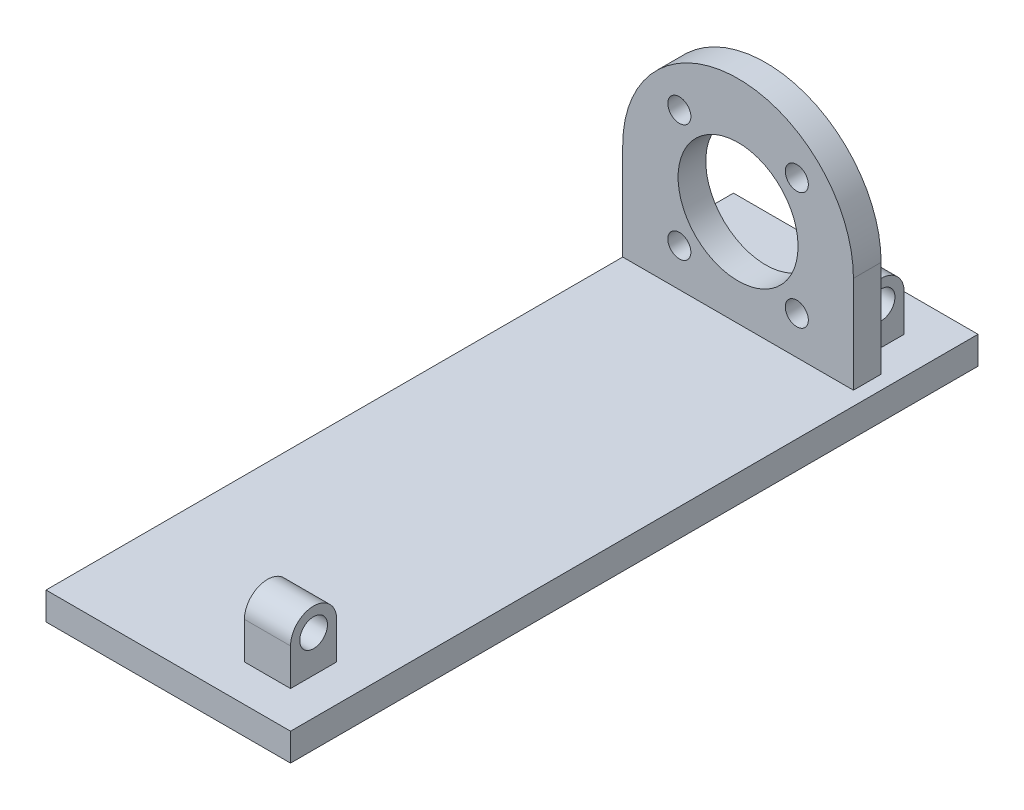
ISO-10303-21;
HEADER;
FILE_DESCRIPTION(('STEP AP214'),'2;1');
FILE_NAME('part.step','',(''),(''),'','','');
FILE_SCHEMA(('AUTOMOTIVE_DESIGN { 1 0 10303 214 1 1 1 1 }'));
ENDSEC;
DATA;
#1=APPLICATION_CONTEXT('core data for automotive mechanical design processes');
#2=APPLICATION_PROTOCOL_DEFINITION('international standard','automotive_design',2000,#1);
#3=PRODUCT_CONTEXT('',#1,'mechanical');
#4=PRODUCT('Part','Part','',(#3));
#5=PRODUCT_RELATED_PRODUCT_CATEGORY('part','',(#4));
#6=PRODUCT_DEFINITION_FORMATION('','',#4);
#7=PRODUCT_DEFINITION_CONTEXT('part definition',#1,'design');
#8=PRODUCT_DEFINITION('design','',#6,#7);
#9=PRODUCT_DEFINITION_SHAPE('','',#8);
#10=(LENGTH_UNIT() NAMED_UNIT(*) SI_UNIT(.MILLI.,.METRE.));
#11=(NAMED_UNIT(*) PLANE_ANGLE_UNIT() SI_UNIT($,.RADIAN.));
#12=(NAMED_UNIT(*) SI_UNIT($,.STERADIAN.) SOLID_ANGLE_UNIT());
#13=UNCERTAINTY_MEASURE_WITH_UNIT(LENGTH_MEASURE(1.E-05),#10,'distance_accuracy_value','');
#14=(GEOMETRIC_REPRESENTATION_CONTEXT(3) GLOBAL_UNCERTAINTY_ASSIGNED_CONTEXT((#13)) GLOBAL_UNIT_ASSIGNED_CONTEXT((#10,
#11,#12)) REPRESENTATION_CONTEXT('',''));
#15=CARTESIAN_POINT('',(0.,0.,0.));
#16=DIRECTION('',(0.,0.,1.));
#17=DIRECTION('',(1.,0.,0.));
#18=AXIS2_PLACEMENT_3D('',#15,#16,#17);
#19=CARTESIAN_POINT('',(25.,-9.,3.));
#20=DIRECTION('',(-1.,0.,0.));
#21=DIRECTION('',(0.,-1.,0.));
#22=AXIS2_PLACEMENT_3D('',#19,#20,#21);
#23=PLANE('',#22);
#24=DIRECTION('',(0.,0.,1.));
#25=VECTOR('',#24,1.);
#26=CARTESIAN_POINT('',(25.,-12.,-3.));
#27=LINE('',#26,#25);
#28=CARTESIAN_POINT('',(25.,-12.,-3.));
#29=VERTEX_POINT('',#28);
#30=CARTESIAN_POINT('',(25.,-12.,3.));
#31=VERTEX_POINT('',#30);
#32=EDGE_CURVE('E189',#29,#31,#27,.T.);
#33=ORIENTED_EDGE('',*,*,#32,.F.);
#34=DIRECTION('',(0.,1.,0.));
#35=VECTOR('',#34,1.);
#36=CARTESIAN_POINT('',(25.,-9.,-3.));
#37=LINE('',#36,#35);
#38=CARTESIAN_POINT('',(25.,8.99999999999999,-3.));
#39=VERTEX_POINT('',#38);
#40=EDGE_CURVE('E322',#29,#39,#37,.T.);
#41=ORIENTED_EDGE('',*,*,#40,.T.);
#42=DIRECTION('',(0.,0.,-1.));
#43=VECTOR('',#42,1.);
#44=CARTESIAN_POINT('',(25.,8.99999999999999,3.));
#45=LINE('',#44,#43);
#46=CARTESIAN_POINT('',(25.,8.99999999999999,3.));
#47=VERTEX_POINT('',#46);
#48=EDGE_CURVE('E51',#47,#39,#45,.T.);
#49=ORIENTED_EDGE('',*,*,#48,.F.);
#50=DIRECTION('',(0.,1.,0.));
#51=VECTOR('',#50,1.);
#52=CARTESIAN_POINT('',(25.,-9.,3.));
#53=LINE('',#52,#51);
#54=EDGE_CURVE('E324',#31,#47,#53,.T.);
#55=ORIENTED_EDGE('',*,*,#54,.F.);
#56=EDGE_LOOP('',(#33,#41,#49,#55));
#57=FACE_BOUND('',#56,.T.);
#58=ADVANCED_FACE('F43',(#57),#23,.F.);
#59=CARTESIAN_POINT('',(0.,9.,-3.));
#60=DIRECTION('',(0.,0.,1.));
#61=DIRECTION('',(1.,0.,0.));
#62=AXIS2_PLACEMENT_3D('',#59,#60,#61);
#63=PLANE('',#62);
#64=CARTESIAN_POINT('',(-12.7279220613578,21.7279220613579,-3.));
#65=DIRECTION('',(0.,0.,1.));
#66=DIRECTION('',(1.,0.,0.));
#67=AXIS2_PLACEMENT_3D('',#64,#65,#66);
#68=CIRCLE('',#67,2.49999999999908);
#69=CARTESIAN_POINT('',(-10.2279220613588,21.7279220613579,-3.));
#70=VERTEX_POINT('',#69);
#71=EDGE_CURVE('E279',#70,#70,#68,.T.);
#72=ORIENTED_EDGE('',*,*,#71,.T.);
#73=EDGE_LOOP('',(#72));
#74=FACE_BOUND('',#73,.T.);
#75=CARTESIAN_POINT('',(-12.7279220613579,-3.72792206135783,-3.));
#76=DIRECTION('',(0.,0.,1.));
#77=DIRECTION('',(1.,0.,0.));
#78=AXIS2_PLACEMENT_3D('',#75,#76,#77);
#79=CIRCLE('',#78,2.49999999999936);
#80=CARTESIAN_POINT('',(-10.2279220613585,-3.72792206135783,-3.));
#81=VERTEX_POINT('',#80);
#82=EDGE_CURVE('E293',#81,#81,#79,.T.);
#83=ORIENTED_EDGE('',*,*,#82,.T.);
#84=EDGE_LOOP('',(#83));
#85=FACE_BOUND('',#84,.T.);
#86=CARTESIAN_POINT('',(12.7279220613579,21.7279220613578,-3.));
#87=DIRECTION('',(0.,0.,1.));
#88=DIRECTION('',(1.,0.,0.));
#89=AXIS2_PLACEMENT_3D('',#86,#87,#88);
#90=CIRCLE('',#89,2.5);
#91=CARTESIAN_POINT('',(15.2279220613579,21.7279220613578,-3.));
#92=VERTEX_POINT('',#91);
#93=EDGE_CURVE('E299',#92,#92,#90,.T.);
#94=ORIENTED_EDGE('',*,*,#93,.T.);
#95=EDGE_LOOP('',(#94));
#96=FACE_BOUND('',#95,.T.);
#97=CARTESIAN_POINT('',(0.,9.,-3.));
#98=DIRECTION('',(0.,0.,1.));
#99=DIRECTION('',(1.,0.,0.));
#100=AXIS2_PLACEMENT_3D('',#97,#98,#99);
#101=CIRCLE('',#100,13.);
#102=CARTESIAN_POINT('',(13.,9.,-3.));
#103=VERTEX_POINT('',#102);
#104=EDGE_CURVE('E315',#103,#103,#101,.T.);
#105=ORIENTED_EDGE('',*,*,#104,.T.);
#106=EDGE_LOOP('',(#105));
#107=FACE_BOUND('',#106,.T.);
#108=DIRECTION('',(0.,-1.,0.));
#109=VECTOR('',#108,1.);
#110=CARTESIAN_POINT('',(20.,-4.,-3.));
#111=LINE('',#110,#109);
#112=CARTESIAN_POINT('',(20.,-4.,-3.));
#113=VERTEX_POINT('',#112);
#114=CARTESIAN_POINT('',(20.,-12.,-3.));
#115=VERTEX_POINT('',#114);
#116=EDGE_CURVE('E249',#113,#115,#111,.T.);
#117=ORIENTED_EDGE('',*,*,#116,.F.);
#118=DIRECTION('',(1.,0.,0.));
#119=VECTOR('',#118,1.);
#120=CARTESIAN_POINT('',(10.,-4.,-3.));
#121=LINE('',#120,#119);
#122=CARTESIAN_POINT('',(15.2130726795912,-4.,-3.));
#123=VERTEX_POINT('',#122);
#124=EDGE_CURVE('E250',#123,#113,#121,.T.);
#125=ORIENTED_EDGE('',*,*,#124,.F.);
#126=CARTESIAN_POINT('',(12.7279220613578,-3.72792206135788,-3.));
#127=DIRECTION('',(0.,0.,1.));
#128=DIRECTION('',(1.,0.,0.));
#129=AXIS2_PLACEMENT_3D('',#126,#127,#128);
#130=CIRCLE('',#129,2.50000000000034);
#131=CARTESIAN_POINT('',(10.2427714431244,-4.,-3.));
#132=VERTEX_POINT('',#131);
#133=EDGE_CURVE('E287',#123,#132,#130,.T.);
#134=ORIENTED_EDGE('',*,*,#133,.T.);
#135=CARTESIAN_POINT('',(10.,-4.,-3.));
#136=VERTEX_POINT('',#135);
#137=EDGE_CURVE('E261',#136,#132,#121,.T.);
#138=ORIENTED_EDGE('',*,*,#137,.F.);
#139=DIRECTION('',(0.,-1.,0.));
#140=VECTOR('',#139,1.);
#141=CARTESIAN_POINT('',(10.,-4.,-3.));
#142=LINE('',#141,#140);
#143=CARTESIAN_POINT('',(10.,-12.,-3.));
#144=VERTEX_POINT('',#143);
#145=EDGE_CURVE('E240',#136,#144,#142,.T.);
#146=ORIENTED_EDGE('',*,*,#145,.T.);
#147=DIRECTION('',(1.,0.,0.));
#148=VECTOR('',#147,1.);
#149=CARTESIAN_POINT('',(-25.,-12.,-3.));
#150=LINE('',#149,#148);
#151=CARTESIAN_POINT('',(-25.,-12.,-3.));
#152=VERTEX_POINT('',#151);
#153=EDGE_CURVE('E272',#152,#144,#150,.T.);
#154=ORIENTED_EDGE('',*,*,#153,.F.);
#155=DIRECTION('',(0.,-1.,0.));
#156=VECTOR('',#155,1.);
#157=CARTESIAN_POINT('',(-25.,-9.00000000000001,-3.));
#158=LINE('',#157,#156);
#159=CARTESIAN_POINT('',(-25.,8.99999999999999,-3.));
#160=VERTEX_POINT('',#159);
#161=EDGE_CURVE('E329',#160,#152,#158,.T.);
#162=ORIENTED_EDGE('',*,*,#161,.F.);
#163=CARTESIAN_POINT('',(0.,9.,-3.));
#164=DIRECTION('',(0.,0.,1.));
#165=DIRECTION('',(1.,0.,0.));
#166=AXIS2_PLACEMENT_3D('',#163,#164,#165);
#167=CIRCLE('',#166,25.);
#168=EDGE_CURVE('E317',#39,#160,#167,.T.);
#169=ORIENTED_EDGE('',*,*,#168,.F.);
#170=ORIENTED_EDGE('',*,*,#40,.F.);
#171=EDGE_CURVE('E258',#115,#29,#150,.T.);
#172=ORIENTED_EDGE('',*,*,#171,.F.);
#173=EDGE_LOOP('',(#117,#125,#134,#138,#146,#154,#162,#169,#170,#172));
#174=FACE_BOUND('',#173,.T.);
#175=ADVANCED_FACE('F342',(#74,#85,#96,#107,#174),#63,.F.);
#176=CARTESIAN_POINT('',(0.,9.,3.));
#177=DIRECTION('',(0.,0.,1.));
#178=DIRECTION('',(1.,0.,0.));
#179=AXIS2_PLACEMENT_3D('',#176,#177,#178);
#180=PLANE('',#179);
#181=CARTESIAN_POINT('',(-12.7279220613578,21.7279220613579,3.));
#182=DIRECTION('',(0.,0.,1.));
#183=DIRECTION('',(1.,0.,0.));
#184=AXIS2_PLACEMENT_3D('',#181,#182,#183);
#185=CIRCLE('',#184,2.49999999999908);
#186=CARTESIAN_POINT('',(-10.2279220613588,21.7279220613579,3.));
#187=VERTEX_POINT('',#186);
#188=EDGE_CURVE('E295',#187,#187,#185,.T.);
#189=ORIENTED_EDGE('',*,*,#188,.F.);
#190=EDGE_LOOP('',(#189));
#191=FACE_BOUND('',#190,.T.);
#192=CARTESIAN_POINT('',(-12.7279220613579,-3.72792206135783,3.));
#193=DIRECTION('',(0.,0.,1.));
#194=DIRECTION('',(1.,0.,0.));
#195=AXIS2_PLACEMENT_3D('',#192,#193,#194);
#196=CIRCLE('',#195,2.49999999999936);
#197=CARTESIAN_POINT('',(-10.2279220613585,-3.72792206135783,3.));
#198=VERTEX_POINT('',#197);
#199=EDGE_CURVE('E289',#198,#198,#196,.T.);
#200=ORIENTED_EDGE('',*,*,#199,.F.);
#201=EDGE_LOOP('',(#200));
#202=FACE_BOUND('',#201,.T.);
#203=CARTESIAN_POINT('',(12.7279220613578,-3.72792206135788,3.));
#204=DIRECTION('',(0.,0.,1.));
#205=DIRECTION('',(1.,0.,0.));
#206=AXIS2_PLACEMENT_3D('',#203,#204,#205);
#207=CIRCLE('',#206,2.50000000000034);
#208=CARTESIAN_POINT('',(15.2279220613582,-3.72792206135788,3.));
#209=VERTEX_POINT('',#208);
#210=EDGE_CURVE('E283',#209,#209,#207,.T.);
#211=ORIENTED_EDGE('',*,*,#210,.F.);
#212=EDGE_LOOP('',(#211));
#213=FACE_BOUND('',#212,.T.);
#214=CARTESIAN_POINT('',(12.7279220613579,21.7279220613578,3.));
#215=DIRECTION('',(0.,0.,1.));
#216=DIRECTION('',(1.,0.,0.));
#217=AXIS2_PLACEMENT_3D('',#214,#215,#216);
#218=CIRCLE('',#217,2.5);
#219=CARTESIAN_POINT('',(15.2279220613579,21.7279220613578,3.));
#220=VERTEX_POINT('',#219);
#221=EDGE_CURVE('E284',#220,#220,#218,.T.);
#222=ORIENTED_EDGE('',*,*,#221,.F.);
#223=EDGE_LOOP('',(#222));
#224=FACE_BOUND('',#223,.T.);
#225=DIRECTION('',(-1.,0.,0.));
#226=VECTOR('',#225,1.);
#227=CARTESIAN_POINT('',(25.,-12.,3.));
#228=LINE('',#227,#226);
#229=CARTESIAN_POINT('',(-25.,-12.,3.));
#230=VERTEX_POINT('',#229);
#231=EDGE_CURVE('E305',#31,#230,#228,.T.);
#232=ORIENTED_EDGE('',*,*,#231,.F.);
#233=ORIENTED_EDGE('',*,*,#54,.T.);
#234=CARTESIAN_POINT('',(0.,9.,3.));
#235=DIRECTION('',(0.,0.,1.));
#236=DIRECTION('',(1.,0.,0.));
#237=AXIS2_PLACEMENT_3D('',#234,#235,#236);
#238=CIRCLE('',#237,25.);
#239=CARTESIAN_POINT('',(-25.,8.99999999999999,3.));
#240=VERTEX_POINT('',#239);
#241=EDGE_CURVE('E316',#47,#240,#238,.T.);
#242=ORIENTED_EDGE('',*,*,#241,.T.);
#243=DIRECTION('',(0.,-1.,0.));
#244=VECTOR('',#243,1.);
#245=CARTESIAN_POINT('',(-25.,-9.00000000000001,3.));
#246=LINE('',#245,#244);
#247=EDGE_CURVE('E325',#240,#230,#246,.T.);
#248=ORIENTED_EDGE('',*,*,#247,.T.);
#249=EDGE_LOOP('',(#232,#233,#242,#248));
#250=FACE_BOUND('',#249,.T.);
#251=CARTESIAN_POINT('',(0.,9.,3.));
#252=DIRECTION('',(0.,0.,1.));
#253=DIRECTION('',(1.,0.,0.));
#254=AXIS2_PLACEMENT_3D('',#251,#252,#253);
#255=CIRCLE('',#254,13.);
#256=CARTESIAN_POINT('',(13.,9.,3.));
#257=VERTEX_POINT('',#256);
#258=EDGE_CURVE('E312',#257,#257,#255,.T.);
#259=ORIENTED_EDGE('',*,*,#258,.F.);
#260=EDGE_LOOP('',(#259));
#261=FACE_BOUND('',#260,.T.);
#262=ADVANCED_FACE('F347',(#191,#202,#213,#224,#250,#261),#180,.T.);
#263=CARTESIAN_POINT('',(0.,9.,3.));
#264=DIRECTION('',(0.,0.,-1.));
#265=DIRECTION('',(-1.,0.,0.));
#266=AXIS2_PLACEMENT_3D('',#263,#264,#265);
#267=CYLINDRICAL_SURFACE('',#266,25.);
#268=ORIENTED_EDGE('',*,*,#168,.T.);
#269=DIRECTION('',(0.,0.,-1.));
#270=VECTOR('',#269,1.);
#271=CARTESIAN_POINT('',(-25.,8.99999999999999,3.));
#272=LINE('',#271,#270);
#273=EDGE_CURVE('E11',#240,#160,#272,.T.);
#274=ORIENTED_EDGE('',*,*,#273,.F.);
#275=ORIENTED_EDGE('',*,*,#241,.F.);
#276=ORIENTED_EDGE('',*,*,#48,.T.);
#277=EDGE_LOOP('',(#268,#274,#275,#276));
#278=FACE_BOUND('',#277,.T.);
#279=ADVANCED_FACE('F44',(#278),#267,.T.);
#280=CARTESIAN_POINT('',(-25.,-9.00000000000001,3.));
#281=DIRECTION('',(1.,0.,0.));
#282=DIRECTION('',(0.,0.,-1.));
#283=AXIS2_PLACEMENT_3D('',#280,#281,#282);
#284=PLANE('',#283);
#285=ORIENTED_EDGE('',*,*,#161,.T.);
#286=DIRECTION('',(0.,0.,1.));
#287=VECTOR('',#286,1.);
#288=CARTESIAN_POINT('',(-25.,-12.,-21.));
#289=LINE('',#288,#287);
#290=CARTESIAN_POINT('',(-25.,-12.,-21.));
#291=VERTEX_POINT('',#290);
#292=EDGE_CURVE('E175',#291,#152,#289,.T.);
#293=ORIENTED_EDGE('',*,*,#292,.F.);
#294=DIRECTION('',(0.,1.,0.));
#295=VECTOR('',#294,1.);
#296=CARTESIAN_POINT('',(-25.,-18.,-21.));
#297=LINE('',#296,#295);
#298=CARTESIAN_POINT('',(-25.,-18.,-21.));
#299=VERTEX_POINT('',#298);
#300=EDGE_CURVE('E267',#299,#291,#297,.T.);
#301=ORIENTED_EDGE('',*,*,#300,.F.);
#302=DIRECTION('',(0.,0.,-1.));
#303=VECTOR('',#302,1.);
#304=CARTESIAN_POINT('',(-25.,-18.,3.));
#305=LINE('',#304,#303);
#306=CARTESIAN_POINT('',(-25.,-18.,128.));
#307=VERTEX_POINT('',#306);
#308=EDGE_CURVE('E309',#307,#299,#305,.T.);
#309=ORIENTED_EDGE('',*,*,#308,.F.);
#310=DIRECTION('',(0.,-1.,0.));
#311=VECTOR('',#310,1.);
#312=CARTESIAN_POINT('',(-25.,-12.,128.));
#313=LINE('',#312,#311);
#314=CARTESIAN_POINT('',(-25.,-12.,128.));
#315=VERTEX_POINT('',#314);
#316=EDGE_CURVE('E169',#315,#307,#313,.T.);
#317=ORIENTED_EDGE('',*,*,#316,.F.);
#318=DIRECTION('',(0.,0.,-1.));
#319=VECTOR('',#318,1.);
#320=CARTESIAN_POINT('',(-25.,-12.,110.));
#321=LINE('',#320,#319);
#322=EDGE_CURVE('E310',#315,#230,#321,.T.);
#323=ORIENTED_EDGE('',*,*,#322,.T.);
#324=ORIENTED_EDGE('',*,*,#247,.F.);
#325=ORIENTED_EDGE('',*,*,#273,.T.);
#326=EDGE_LOOP('',(#285,#293,#301,#309,#317,#323,#324,#325));
#327=FACE_BOUND('',#326,.T.);
#328=ADVANCED_FACE('F350',(#327),#284,.F.);
#329=CARTESIAN_POINT('',(0.,9.,3.));
#330=DIRECTION('',(0.,0.,-1.));
#331=DIRECTION('',(-1.,0.,0.));
#332=AXIS2_PLACEMENT_3D('',#329,#330,#331);
#333=CYLINDRICAL_SURFACE('',#332,13.);
#334=ORIENTED_EDGE('',*,*,#258,.T.);
#335=EDGE_LOOP('',(#334));
#336=FACE_BOUND('',#335,.T.);
#337=ORIENTED_EDGE('',*,*,#104,.F.);
#338=EDGE_LOOP('',(#337));
#339=FACE_BOUND('',#338,.T.);
#340=ADVANCED_FACE('F399',(#336,#339),#333,.F.);
#341=CARTESIAN_POINT('',(0.,-18.,0.));
#342=DIRECTION('',(0.,-1.,0.));
#343=DIRECTION('',(0.,0.,-1.));
#344=AXIS2_PLACEMENT_3D('',#341,#342,#343);
#345=PLANE('',#344);
#346=ORIENTED_EDGE('',*,*,#308,.T.);
#347=DIRECTION('',(-1.,0.,0.));
#348=VECTOR('',#347,1.);
#349=CARTESIAN_POINT('',(-25.,-18.,-21.));
#350=LINE('',#349,#348);
#351=CARTESIAN_POINT('',(28.,-18.,-21.));
#352=VERTEX_POINT('',#351);
#353=EDGE_CURVE('E178',#352,#299,#350,.T.);
#354=ORIENTED_EDGE('',*,*,#353,.F.);
#355=DIRECTION('',(0.,0.,-1.));
#356=VECTOR('',#355,1.);
#357=CARTESIAN_POINT('',(28.,-18.,128.));
#358=LINE('',#357,#356);
#359=CARTESIAN_POINT('',(28.,-18.,128.));
#360=VERTEX_POINT('',#359);
#361=EDGE_CURVE('E174',#360,#352,#358,.T.);
#362=ORIENTED_EDGE('',*,*,#361,.F.);
#363=DIRECTION('',(1.,0.,0.));
#364=VECTOR('',#363,1.);
#365=CARTESIAN_POINT('',(-25.,-18.,128.));
#366=LINE('',#365,#364);
#367=EDGE_CURVE('E162',#307,#360,#366,.T.);
#368=ORIENTED_EDGE('',*,*,#367,.F.);
#369=EDGE_LOOP('',(#346,#354,#362,#368));
#370=FACE_BOUND('',#369,.T.);
#371=ADVANCED_FACE('F176',(#370),#345,.T.);
#372=CARTESIAN_POINT('',(25.,-12.,110.));
#373=DIRECTION('',(0.,-1.,0.));
#374=DIRECTION('',(1.,0.,0.));
#375=AXIS2_PLACEMENT_3D('',#372,#373,#374);
#376=PLANE('',#375);
#377=DIRECTION('',(0.,0.,1.));
#378=VECTOR('',#377,1.);
#379=CARTESIAN_POINT('',(10.,-12.,110.));
#380=LINE('',#379,#378);
#381=CARTESIAN_POINT('',(10.,-12.,110.));
#382=VERTEX_POINT('',#381);
#383=CARTESIAN_POINT('',(10.,-12.,120.));
#384=VERTEX_POINT('',#383);
#385=EDGE_CURVE('E59',#382,#384,#380,.T.);
#386=ORIENTED_EDGE('',*,*,#385,.F.);
#387=DIRECTION('',(1.,0.,0.));
#388=VECTOR('',#387,1.);
#389=CARTESIAN_POINT('',(10.,-12.,110.));
#390=LINE('',#389,#388);
#391=CARTESIAN_POINT('',(20.,-12.,110.));
#392=VERTEX_POINT('',#391);
#393=EDGE_CURVE('E62',#382,#392,#390,.T.);
#394=ORIENTED_EDGE('',*,*,#393,.T.);
#395=DIRECTION('',(0.,0.,1.));
#396=VECTOR('',#395,1.);
#397=CARTESIAN_POINT('',(20.,-12.,110.));
#398=LINE('',#397,#396);
#399=CARTESIAN_POINT('',(20.,-12.,120.));
#400=VERTEX_POINT('',#399);
#401=EDGE_CURVE('E214',#392,#400,#398,.T.);
#402=ORIENTED_EDGE('',*,*,#401,.T.);
#403=DIRECTION('',(1.,0.,0.));
#404=VECTOR('',#403,1.);
#405=CARTESIAN_POINT('',(10.,-12.,120.));
#406=LINE('',#405,#404);
#407=EDGE_CURVE('E224',#384,#400,#406,.T.);
#408=ORIENTED_EDGE('',*,*,#407,.F.);
#409=EDGE_LOOP('',(#386,#394,#402,#408));
#410=FACE_BOUND('',#409,.T.);
#411=ORIENTED_EDGE('',*,*,#231,.T.);
#412=ORIENTED_EDGE('',*,*,#322,.F.);
#413=DIRECTION('',(-1.,0.,0.));
#414=VECTOR('',#413,1.);
#415=CARTESIAN_POINT('',(25.,-12.,128.));
#416=LINE('',#415,#414);
#417=CARTESIAN_POINT('',(28.,-12.,128.));
#418=VERTEX_POINT('',#417);
#419=EDGE_CURVE('E171',#418,#315,#416,.T.);
#420=ORIENTED_EDGE('',*,*,#419,.F.);
#421=DIRECTION('',(0.,0.,1.));
#422=VECTOR('',#421,1.);
#423=CARTESIAN_POINT('',(28.,-12.,-21.));
#424=LINE('',#423,#422);
#425=CARTESIAN_POINT('',(28.,-12.,-21.));
#426=VERTEX_POINT('',#425);
#427=EDGE_CURVE('E190',#426,#418,#424,.T.);
#428=ORIENTED_EDGE('',*,*,#427,.F.);
#429=DIRECTION('',(1.,0.,0.));
#430=VECTOR('',#429,1.);
#431=CARTESIAN_POINT('',(-25.,-12.,-21.));
#432=LINE('',#431,#430);
#433=EDGE_CURVE('E270',#291,#426,#432,.T.);
#434=ORIENTED_EDGE('',*,*,#433,.F.);
#435=ORIENTED_EDGE('',*,*,#292,.T.);
#436=ORIENTED_EDGE('',*,*,#153,.T.);
#437=DIRECTION('',(0.,0.,-1.));
#438=VECTOR('',#437,1.);
#439=CARTESIAN_POINT('',(10.,-12.,-3.));
#440=LINE('',#439,#438);
#441=CARTESIAN_POINT('',(10.,-12.,-13.));
#442=VERTEX_POINT('',#441);
#443=EDGE_CURVE('E241',#144,#442,#440,.T.);
#444=ORIENTED_EDGE('',*,*,#443,.T.);
#445=DIRECTION('',(1.,0.,0.));
#446=VECTOR('',#445,1.);
#447=CARTESIAN_POINT('',(10.,-12.,-13.));
#448=LINE('',#447,#446);
#449=CARTESIAN_POINT('',(20.,-12.,-13.));
#450=VERTEX_POINT('',#449);
#451=EDGE_CURVE('E259',#442,#450,#448,.T.);
#452=ORIENTED_EDGE('',*,*,#451,.T.);
#453=DIRECTION('',(0.,0.,-1.));
#454=VECTOR('',#453,1.);
#455=CARTESIAN_POINT('',(20.,-12.,-3.));
#456=LINE('',#455,#454);
#457=EDGE_CURVE('E255',#115,#450,#456,.T.);
#458=ORIENTED_EDGE('',*,*,#457,.F.);
#459=ORIENTED_EDGE('',*,*,#171,.T.);
#460=ORIENTED_EDGE('',*,*,#32,.T.);
#461=EDGE_LOOP('',(#411,#412,#420,#428,#434,#435,#436,#444,#452,#458,#459,#460));
#462=FACE_BOUND('',#461,.T.);
#463=ADVANCED_FACE('F355',(#410,#462),#376,.F.);
#464=CARTESIAN_POINT('',(12.7279220613579,21.7279220613578,-3.));
#465=DIRECTION('',(0.,0.,1.));
#466=DIRECTION('',(1.,0.,0.));
#467=AXIS2_PLACEMENT_3D('',#464,#465,#466);
#468=CYLINDRICAL_SURFACE('',#467,2.5);
#469=ORIENTED_EDGE('',*,*,#93,.F.);
#470=EDGE_LOOP('',(#469));
#471=FACE_BOUND('',#470,.T.);
#472=ORIENTED_EDGE('',*,*,#221,.T.);
#473=EDGE_LOOP('',(#472));
#474=FACE_BOUND('',#473,.T.);
#475=ADVANCED_FACE('F420',(#471,#474),#468,.F.);
#476=CARTESIAN_POINT('',(12.7279220613578,-3.72792206135788,-3.));
#477=DIRECTION('',(0.,0.,1.));
#478=DIRECTION('',(1.,0.,0.));
#479=AXIS2_PLACEMENT_3D('',#476,#477,#478);
#480=CYLINDRICAL_SURFACE('',#479,2.50000000000034);
#481=EDGE_CURVE('E282',#132,#123,#130,.T.);
#482=ORIENTED_EDGE('',*,*,#481,.F.);
#483=ORIENTED_EDGE('',*,*,#133,.F.);
#484=EDGE_LOOP('',(#482,#483));
#485=FACE_BOUND('',#484,.T.);
#486=ORIENTED_EDGE('',*,*,#210,.T.);
#487=EDGE_LOOP('',(#486));
#488=FACE_BOUND('',#487,.T.);
#489=ADVANCED_FACE('F371',(#485,#488),#480,.F.);
#490=CARTESIAN_POINT('',(-12.7279220613579,-3.72792206135783,-3.));
#491=DIRECTION('',(0.,0.,1.));
#492=DIRECTION('',(1.,0.,0.));
#493=AXIS2_PLACEMENT_3D('',#490,#491,#492);
#494=CYLINDRICAL_SURFACE('',#493,2.49999999999936);
#495=ORIENTED_EDGE('',*,*,#82,.F.);
#496=EDGE_LOOP('',(#495));
#497=FACE_BOUND('',#496,.T.);
#498=ORIENTED_EDGE('',*,*,#199,.T.);
#499=EDGE_LOOP('',(#498));
#500=FACE_BOUND('',#499,.T.);
#501=ADVANCED_FACE('F424',(#497,#500),#494,.F.);
#502=CARTESIAN_POINT('',(-12.7279220613578,21.7279220613579,-3.));
#503=DIRECTION('',(0.,0.,1.));
#504=DIRECTION('',(1.,0.,0.));
#505=AXIS2_PLACEMENT_3D('',#502,#503,#504);
#506=CYLINDRICAL_SURFACE('',#505,2.49999999999908);
#507=ORIENTED_EDGE('',*,*,#71,.F.);
#508=EDGE_LOOP('',(#507));
#509=FACE_BOUND('',#508,.T.);
#510=ORIENTED_EDGE('',*,*,#188,.T.);
#511=EDGE_LOOP('',(#510));
#512=FACE_BOUND('',#511,.T.);
#513=ADVANCED_FACE('F386',(#509,#512),#506,.F.);
#514=CARTESIAN_POINT('',(0.,0.,128.));
#515=DIRECTION('',(0.,0.,1.));
#516=DIRECTION('',(1.,0.,0.));
#517=AXIS2_PLACEMENT_3D('',#514,#515,#516);
#518=PLANE('',#517);
#519=ORIENTED_EDGE('',*,*,#367,.T.);
#520=DIRECTION('',(0.,-1.,0.));
#521=VECTOR('',#520,1.);
#522=CARTESIAN_POINT('',(28.,-12.,128.));
#523=LINE('',#522,#521);
#524=EDGE_CURVE('E170',#418,#360,#523,.T.);
#525=ORIENTED_EDGE('',*,*,#524,.F.);
#526=ORIENTED_EDGE('',*,*,#419,.T.);
#527=ORIENTED_EDGE('',*,*,#316,.T.);
#528=EDGE_LOOP('',(#519,#525,#526,#527));
#529=FACE_BOUND('',#528,.T.);
#530=ADVANCED_FACE('F165',(#529),#518,.T.);
#531=CARTESIAN_POINT('',(0.,0.,-21.));
#532=DIRECTION('',(0.,0.,-1.));
#533=DIRECTION('',(-1.,0.,0.));
#534=AXIS2_PLACEMENT_3D('',#531,#532,#533);
#535=PLANE('',#534);
#536=ORIENTED_EDGE('',*,*,#300,.T.);
#537=ORIENTED_EDGE('',*,*,#433,.T.);
#538=DIRECTION('',(0.,1.,0.));
#539=VECTOR('',#538,1.);
#540=CARTESIAN_POINT('',(28.,-18.,-21.));
#541=LINE('',#540,#539);
#542=EDGE_CURVE('E185',#352,#426,#541,.T.);
#543=ORIENTED_EDGE('',*,*,#542,.F.);
#544=ORIENTED_EDGE('',*,*,#353,.T.);
#545=EDGE_LOOP('',(#536,#537,#543,#544));
#546=FACE_BOUND('',#545,.T.);
#547=ADVANCED_FACE('F376',(#546),#535,.T.);
#548=CARTESIAN_POINT('',(10.,-4.,-8.));
#549=DIRECTION('',(1.,0.,0.));
#550=DIRECTION('',(0.,0.,-1.));
#551=AXIS2_PLACEMENT_3D('',#548,#549,#550);
#552=CYLINDRICAL_SURFACE('',#551,5.);
#553=CARTESIAN_POINT('',(20.,-4.,-8.));
#554=DIRECTION('',(1.,0.,0.));
#555=DIRECTION('',(0.,0.,-1.));
#556=AXIS2_PLACEMENT_3D('',#553,#554,#555);
#557=CIRCLE('',#556,5.);
#558=CARTESIAN_POINT('',(20.,-4.,-13.));
#559=VERTEX_POINT('',#558);
#560=EDGE_CURVE('E233',#559,#113,#557,.T.);
#561=ORIENTED_EDGE('',*,*,#560,.F.);
#562=DIRECTION('',(1.,0.,0.));
#563=VECTOR('',#562,1.);
#564=CARTESIAN_POINT('',(10.,-4.,-13.));
#565=LINE('',#564,#563);
#566=CARTESIAN_POINT('',(10.,-4.,-13.));
#567=VERTEX_POINT('',#566);
#568=EDGE_CURVE('E260',#567,#559,#565,.T.);
#569=ORIENTED_EDGE('',*,*,#568,.F.);
#570=CARTESIAN_POINT('',(10.,-4.,-8.));
#571=DIRECTION('',(1.,0.,0.));
#572=DIRECTION('',(0.,0.,-1.));
#573=AXIS2_PLACEMENT_3D('',#570,#571,#572);
#574=CIRCLE('',#573,5.);
#575=EDGE_CURVE('E234',#567,#136,#574,.T.);
#576=ORIENTED_EDGE('',*,*,#575,.T.);
#577=ORIENTED_EDGE('',*,*,#137,.T.);
#578=EDGE_CURVE('E266',#132,#123,#121,.T.);
#579=ORIENTED_EDGE('',*,*,#578,.T.);
#580=ORIENTED_EDGE('',*,*,#124,.T.);
#581=EDGE_LOOP('',(#561,#569,#576,#577,#579,#580));
#582=FACE_BOUND('',#581,.T.);
#583=ADVANCED_FACE('F361',(#582),#552,.T.);
#584=CARTESIAN_POINT('',(10.,-4.,-13.));
#585=DIRECTION('',(0.,0.,-1.));
#586=DIRECTION('',(-1.,0.,0.));
#587=AXIS2_PLACEMENT_3D('',#584,#585,#586);
#588=PLANE('',#587);
#589=DIRECTION('',(0.,1.,0.));
#590=VECTOR('',#589,1.);
#591=CARTESIAN_POINT('',(20.,-4.,-13.));
#592=LINE('',#591,#590);
#593=EDGE_CURVE('E238',#450,#559,#592,.T.);
#594=ORIENTED_EDGE('',*,*,#593,.F.);
#595=ORIENTED_EDGE('',*,*,#451,.F.);
#596=DIRECTION('',(0.,1.,0.));
#597=VECTOR('',#596,1.);
#598=CARTESIAN_POINT('',(10.,-4.,-13.));
#599=LINE('',#598,#597);
#600=EDGE_CURVE('E242',#442,#567,#599,.T.);
#601=ORIENTED_EDGE('',*,*,#600,.T.);
#602=ORIENTED_EDGE('',*,*,#568,.T.);
#603=EDGE_LOOP('',(#594,#595,#601,#602));
#604=FACE_BOUND('',#603,.T.);
#605=ADVANCED_FACE('F381',(#604),#588,.T.);
#606=CARTESIAN_POINT('',(10.,-4.,-3.));
#607=DIRECTION('',(0.,0.,1.));
#608=DIRECTION('',(0.,-1.,0.));
#609=AXIS2_PLACEMENT_3D('',#606,#607,#608);
#610=PLANE('',#609);
#611=ORIENTED_EDGE('',*,*,#578,.F.);
#612=ORIENTED_EDGE('',*,*,#481,.T.);
#613=EDGE_LOOP('',(#611,#612));
#614=FACE_BOUND('',#613,.T.);
#615=ADVANCED_FACE('F368',(#614),#610,.T.);
#616=CARTESIAN_POINT('',(10.,-4.,-8.));
#617=DIRECTION('',(1.,0.,0.));
#618=DIRECTION('',(0.,0.,-1.));
#619=AXIS2_PLACEMENT_3D('',#616,#617,#618);
#620=PLANE('',#619);
#621=CARTESIAN_POINT('',(10.,-4.,-8.));
#622=DIRECTION('',(1.,0.,0.));
#623=DIRECTION('',(0.,0.,-1.));
#624=AXIS2_PLACEMENT_3D('',#621,#622,#623);
#625=CIRCLE('',#624,3.);
#626=CARTESIAN_POINT('',(10.,-4.,-11.));
#627=VERTEX_POINT('',#626);
#628=EDGE_CURVE('E226',#627,#627,#625,.T.);
#629=ORIENTED_EDGE('',*,*,#628,.T.);
#630=EDGE_LOOP('',(#629));
#631=FACE_BOUND('',#630,.T.);
#632=ORIENTED_EDGE('',*,*,#575,.F.);
#633=ORIENTED_EDGE('',*,*,#600,.F.);
#634=ORIENTED_EDGE('',*,*,#443,.F.);
#635=ORIENTED_EDGE('',*,*,#145,.F.);
#636=EDGE_LOOP('',(#632,#633,#634,#635));
#637=FACE_BOUND('',#636,.T.);
#638=ADVANCED_FACE('F454',(#631,#637),#620,.F.);
#639=CARTESIAN_POINT('',(20.,-4.,-8.));
#640=DIRECTION('',(1.,0.,0.));
#641=DIRECTION('',(0.,0.,-1.));
#642=AXIS2_PLACEMENT_3D('',#639,#640,#641);
#643=PLANE('',#642);
#644=CARTESIAN_POINT('',(20.,-4.,-8.));
#645=DIRECTION('',(1.,0.,0.));
#646=DIRECTION('',(0.,0.,-1.));
#647=AXIS2_PLACEMENT_3D('',#644,#645,#646);
#648=CIRCLE('',#647,3.);
#649=CARTESIAN_POINT('',(20.,-4.,-11.));
#650=VERTEX_POINT('',#649);
#651=EDGE_CURVE('E221',#650,#650,#648,.T.);
#652=ORIENTED_EDGE('',*,*,#651,.F.);
#653=EDGE_LOOP('',(#652));
#654=FACE_BOUND('',#653,.T.);
#655=ORIENTED_EDGE('',*,*,#560,.T.);
#656=ORIENTED_EDGE('',*,*,#116,.T.);
#657=ORIENTED_EDGE('',*,*,#457,.T.);
#658=ORIENTED_EDGE('',*,*,#593,.T.);
#659=EDGE_LOOP('',(#655,#656,#657,#658));
#660=FACE_BOUND('',#659,.T.);
#661=ADVANCED_FACE('F359',(#654,#660),#643,.T.);
#662=CARTESIAN_POINT('',(10.,-4.,-8.));
#663=DIRECTION('',(1.,0.,0.));
#664=DIRECTION('',(0.,0.,-1.));
#665=AXIS2_PLACEMENT_3D('',#662,#663,#664);
#666=CYLINDRICAL_SURFACE('',#665,3.);
#667=ORIENTED_EDGE('',*,*,#628,.F.);
#668=EDGE_LOOP('',(#667));
#669=FACE_BOUND('',#668,.T.);
#670=ORIENTED_EDGE('',*,*,#651,.T.);
#671=EDGE_LOOP('',(#670));
#672=FACE_BOUND('',#671,.T.);
#673=ADVANCED_FACE('F471',(#669,#672),#666,.F.);
#674=CARTESIAN_POINT('',(10.,-4.,115.));
#675=DIRECTION('',(1.,0.,0.));
#676=DIRECTION('',(0.,0.,1.));
#677=AXIS2_PLACEMENT_3D('',#674,#675,#676);
#678=PLANE('',#677);
#679=CARTESIAN_POINT('',(10.,-4.,115.));
#680=DIRECTION('',(-1.,0.,0.));
#681=DIRECTION('',(0.,0.,1.));
#682=AXIS2_PLACEMENT_3D('',#679,#680,#681);
#683=CIRCLE('',#682,5.);
#684=CARTESIAN_POINT('',(10.,-4.,120.));
#685=VERTEX_POINT('',#684);
#686=CARTESIAN_POINT('',(10.,-4.,110.));
#687=VERTEX_POINT('',#686);
#688=EDGE_CURVE('E201',#685,#687,#683,.T.);
#689=ORIENTED_EDGE('',*,*,#688,.T.);
#690=DIRECTION('',(0.,-1.,0.));
#691=VECTOR('',#690,1.);
#692=CARTESIAN_POINT('',(10.,-4.,110.));
#693=LINE('',#692,#691);
#694=EDGE_CURVE('E206',#687,#382,#693,.T.);
#695=ORIENTED_EDGE('',*,*,#694,.T.);
#696=ORIENTED_EDGE('',*,*,#385,.T.);
#697=DIRECTION('',(0.,1.,0.));
#698=VECTOR('',#697,1.);
#699=CARTESIAN_POINT('',(10.,-4.,120.));
#700=LINE('',#699,#698);
#701=EDGE_CURVE('E203',#384,#685,#700,.T.);
#702=ORIENTED_EDGE('',*,*,#701,.T.);
#703=EDGE_LOOP('',(#689,#695,#696,#702));
#704=FACE_BOUND('',#703,.T.);
#705=CARTESIAN_POINT('',(10.,-4.,115.));
#706=DIRECTION('',(-1.,0.,0.));
#707=DIRECTION('',(0.,0.,1.));
#708=AXIS2_PLACEMENT_3D('',#705,#706,#707);
#709=CIRCLE('',#708,3.);
#710=CARTESIAN_POINT('',(10.,-4.,118.));
#711=VERTEX_POINT('',#710);
#712=EDGE_CURVE('E194',#711,#711,#709,.T.);
#713=ORIENTED_EDGE('',*,*,#712,.F.);
#714=EDGE_LOOP('',(#713));
#715=FACE_BOUND('',#714,.T.);
#716=ADVANCED_FACE('F477',(#704,#715),#678,.F.);
#717=CARTESIAN_POINT('',(20.,-4.,115.));
#718=DIRECTION('',(1.,0.,0.));
#719=DIRECTION('',(0.,0.,1.));
#720=AXIS2_PLACEMENT_3D('',#717,#718,#719);
#721=PLANE('',#720);
#722=CARTESIAN_POINT('',(20.,-4.,115.));
#723=DIRECTION('',(-1.,0.,0.));
#724=DIRECTION('',(0.,0.,1.));
#725=AXIS2_PLACEMENT_3D('',#722,#723,#724);
#726=CIRCLE('',#725,5.);
#727=CARTESIAN_POINT('',(20.,-4.,120.));
#728=VERTEX_POINT('',#727);
#729=CARTESIAN_POINT('',(20.,-4.,110.));
#730=VERTEX_POINT('',#729);
#731=EDGE_CURVE('E196',#728,#730,#726,.T.);
#732=ORIENTED_EDGE('',*,*,#731,.F.);
#733=DIRECTION('',(0.,1.,0.));
#734=VECTOR('',#733,1.);
#735=CARTESIAN_POINT('',(20.,-4.,120.));
#736=LINE('',#735,#734);
#737=EDGE_CURVE('E212',#400,#728,#736,.T.);
#738=ORIENTED_EDGE('',*,*,#737,.F.);
#739=ORIENTED_EDGE('',*,*,#401,.F.);
#740=DIRECTION('',(0.,-1.,0.));
#741=VECTOR('',#740,1.);
#742=CARTESIAN_POINT('',(20.,-4.,110.));
#743=LINE('',#742,#741);
#744=EDGE_CURVE('E205',#730,#392,#743,.T.);
#745=ORIENTED_EDGE('',*,*,#744,.F.);
#746=EDGE_LOOP('',(#732,#738,#739,#745));
#747=FACE_BOUND('',#746,.T.);
#748=CARTESIAN_POINT('',(20.,-4.,115.));
#749=DIRECTION('',(-1.,0.,0.));
#750=DIRECTION('',(0.,0.,1.));
#751=AXIS2_PLACEMENT_3D('',#748,#749,#750);
#752=CIRCLE('',#751,3.);
#753=CARTESIAN_POINT('',(20.,-4.,118.));
#754=VERTEX_POINT('',#753);
#755=EDGE_CURVE('E192',#754,#754,#752,.T.);
#756=ORIENTED_EDGE('',*,*,#755,.T.);
#757=EDGE_LOOP('',(#756));
#758=FACE_BOUND('',#757,.T.);
#759=ADVANCED_FACE('F490',(#747,#758),#721,.T.);
#760=CARTESIAN_POINT('',(10.,-4.,115.));
#761=DIRECTION('',(1.,0.,0.));
#762=DIRECTION('',(0.,0.,-1.));
#763=AXIS2_PLACEMENT_3D('',#760,#761,#762);
#764=CYLINDRICAL_SURFACE('',#763,5.);
#765=ORIENTED_EDGE('',*,*,#731,.T.);
#766=DIRECTION('',(1.,0.,0.));
#767=VECTOR('',#766,1.);
#768=CARTESIAN_POINT('',(10.,-4.,110.));
#769=LINE('',#768,#767);
#770=EDGE_CURVE('E216',#687,#730,#769,.T.);
#771=ORIENTED_EDGE('',*,*,#770,.F.);
#772=ORIENTED_EDGE('',*,*,#688,.F.);
#773=DIRECTION('',(1.,0.,0.));
#774=VECTOR('',#773,1.);
#775=CARTESIAN_POINT('',(10.,-4.,120.));
#776=LINE('',#775,#774);
#777=EDGE_CURVE('E208',#685,#728,#776,.T.);
#778=ORIENTED_EDGE('',*,*,#777,.T.);
#779=EDGE_LOOP('',(#765,#771,#772,#778));
#780=FACE_BOUND('',#779,.T.);
#781=ADVANCED_FACE('F498',(#780),#764,.T.);
#782=CARTESIAN_POINT('',(10.,-4.,110.));
#783=DIRECTION('',(0.,0.,1.));
#784=DIRECTION('',(0.,-1.,0.));
#785=AXIS2_PLACEMENT_3D('',#782,#783,#784);
#786=PLANE('',#785);
#787=ORIENTED_EDGE('',*,*,#744,.T.);
#788=ORIENTED_EDGE('',*,*,#393,.F.);
#789=ORIENTED_EDGE('',*,*,#694,.F.);
#790=ORIENTED_EDGE('',*,*,#770,.T.);
#791=EDGE_LOOP('',(#787,#788,#789,#790));
#792=FACE_BOUND('',#791,.T.);
#793=ADVANCED_FACE('F510',(#792),#786,.F.);
#794=CARTESIAN_POINT('',(10.,-4.,120.));
#795=DIRECTION('',(0.,0.,-1.));
#796=DIRECTION('',(-1.,0.,0.));
#797=AXIS2_PLACEMENT_3D('',#794,#795,#796);
#798=PLANE('',#797);
#799=ORIENTED_EDGE('',*,*,#737,.T.);
#800=ORIENTED_EDGE('',*,*,#777,.F.);
#801=ORIENTED_EDGE('',*,*,#701,.F.);
#802=ORIENTED_EDGE('',*,*,#407,.T.);
#803=EDGE_LOOP('',(#799,#800,#801,#802));
#804=FACE_BOUND('',#803,.T.);
#805=ADVANCED_FACE('F516',(#804),#798,.F.);
#806=CARTESIAN_POINT('',(10.,-4.,115.));
#807=DIRECTION('',(1.,0.,0.));
#808=DIRECTION('',(0.,0.,-1.));
#809=AXIS2_PLACEMENT_3D('',#806,#807,#808);
#810=CYLINDRICAL_SURFACE('',#809,3.);
#811=ORIENTED_EDGE('',*,*,#712,.T.);
#812=EDGE_LOOP('',(#811));
#813=FACE_BOUND('',#812,.T.);
#814=ORIENTED_EDGE('',*,*,#755,.F.);
#815=EDGE_LOOP('',(#814));
#816=FACE_BOUND('',#815,.T.);
#817=ADVANCED_FACE('F524',(#813,#816),#810,.F.);
#818=CARTESIAN_POINT('',(28.,0.,0.));
#819=DIRECTION('',(1.,0.,0.));
#820=DIRECTION('',(0.,0.,-1.));
#821=AXIS2_PLACEMENT_3D('',#818,#819,#820);
#822=PLANE('',#821);
#823=ORIENTED_EDGE('',*,*,#524,.T.);
#824=ORIENTED_EDGE('',*,*,#361,.T.);
#825=ORIENTED_EDGE('',*,*,#542,.T.);
#826=ORIENTED_EDGE('',*,*,#427,.T.);
#827=EDGE_LOOP('',(#823,#824,#825,#826));
#828=FACE_BOUND('',#827,.T.);
#829=ADVANCED_FACE('F184',(#828),#822,.T.);
#830=CLOSED_SHELL('',(#58,#175,#262,#279,#328,#340,#371,#463,#475,#489,#501,#513,#530,#547,#583,
#605,#615,#638,#661,#673,#716,#759,#781,#793,#805,#817,#829));
#831=MANIFOLD_SOLID_BREP('B2',#830);
#832=ADVANCED_BREP_SHAPE_REPRESENTATION('',(#18,#831),#14);
#833=SHAPE_DEFINITION_REPRESENTATION(#9,#832);
ENDSEC;
END-ISO-10303-21;
